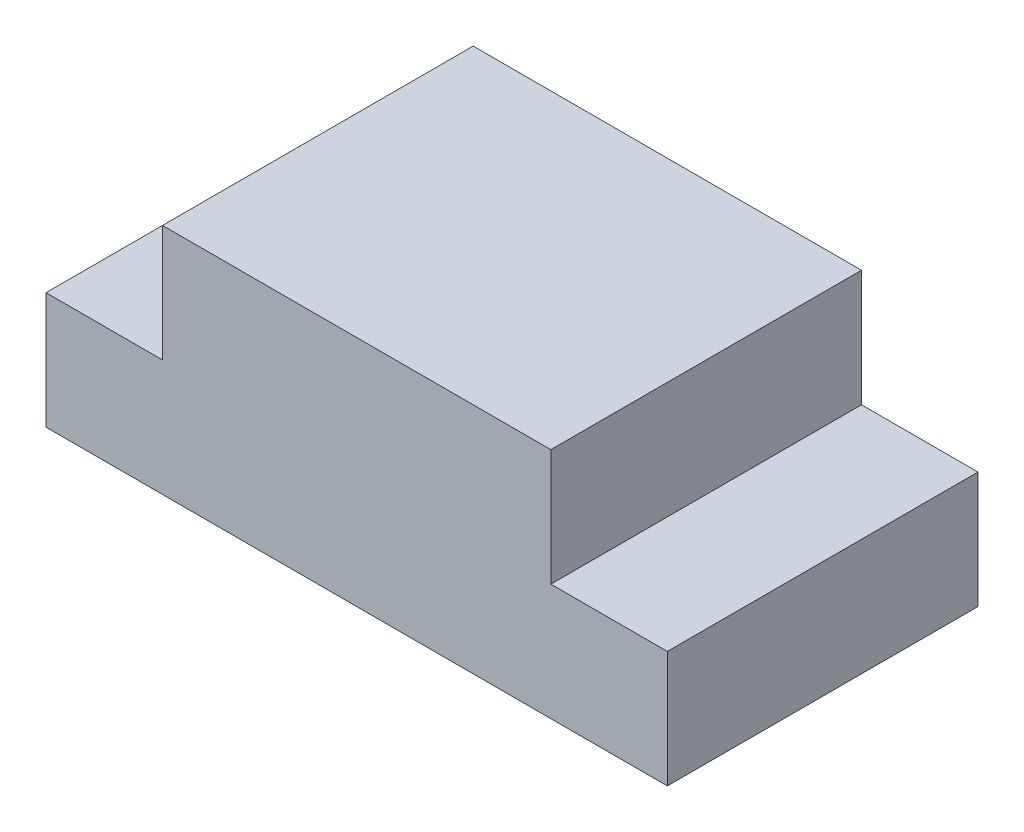
ISO-10303-21;
HEADER;
FILE_DESCRIPTION(('STEP AP214'),'2;1');
FILE_NAME('part.step','',(''),(''),'','','');
FILE_SCHEMA(('AUTOMOTIVE_DESIGN { 1 0 10303 214 1 1 1 1 }'));
ENDSEC;
DATA;
#1=APPLICATION_CONTEXT('core data for automotive mechanical design processes');
#2=APPLICATION_PROTOCOL_DEFINITION('international standard','automotive_design',2000,#1);
#3=PRODUCT_CONTEXT('',#1,'mechanical');
#4=PRODUCT('Part','Part','',(#3));
#5=PRODUCT_RELATED_PRODUCT_CATEGORY('part','',(#4));
#6=PRODUCT_DEFINITION_FORMATION('','',#4);
#7=PRODUCT_DEFINITION_CONTEXT('part definition',#1,'design');
#8=PRODUCT_DEFINITION('design','',#6,#7);
#9=PRODUCT_DEFINITION_SHAPE('','',#8);
#10=(LENGTH_UNIT() NAMED_UNIT(*) SI_UNIT(.MILLI.,.METRE.));
#11=(NAMED_UNIT(*) PLANE_ANGLE_UNIT() SI_UNIT($,.RADIAN.));
#12=(NAMED_UNIT(*) SI_UNIT($,.STERADIAN.) SOLID_ANGLE_UNIT());
#13=UNCERTAINTY_MEASURE_WITH_UNIT(LENGTH_MEASURE(1.E-05),#10,'distance_accuracy_value','');
#14=(GEOMETRIC_REPRESENTATION_CONTEXT(3) GLOBAL_UNCERTAINTY_ASSIGNED_CONTEXT((#13)) GLOBAL_UNIT_ASSIGNED_CONTEXT((#10,
#11,#12)) REPRESENTATION_CONTEXT('',''));
#15=CARTESIAN_POINT('',(0.,0.,0.));
#16=DIRECTION('',(0.,0.,1.));
#17=DIRECTION('',(1.,0.,0.));
#18=AXIS2_PLACEMENT_3D('',#15,#16,#17);
#19=CARTESIAN_POINT('',(0.,0.3,0.));
#20=DIRECTION('',(0.,-1.,0.));
#21=DIRECTION('',(0.,0.,-1.));
#22=AXIS2_PLACEMENT_3D('',#19,#20,#21);
#23=PLANE('',#22);
#24=DIRECTION('',(-1.,0.,0.));
#25=VECTOR('',#24,1.);
#26=CARTESIAN_POINT('',(-0.8,0.3,0.4));
#27=LINE('',#26,#25);
#28=CARTESIAN_POINT('',(0.5,0.3,0.4));
#29=VERTEX_POINT('',#28);
#30=CARTESIAN_POINT('',(0.8,0.3,0.4));
#31=VERTEX_POINT('',#30);
#32=EDGE_CURVE('E121',#29,#31,#27,.F.);
#33=ORIENTED_EDGE('',*,*,#32,.T.);
#34=DIRECTION('',(0.,0.,1.));
#35=VECTOR('',#34,1.);
#36=CARTESIAN_POINT('',(0.8,0.3,0.4));
#37=LINE('',#36,#35);
#38=CARTESIAN_POINT('',(0.8,0.3,-0.4));
#39=VERTEX_POINT('',#38);
#40=EDGE_CURVE('E95',#31,#39,#37,.F.);
#41=ORIENTED_EDGE('',*,*,#40,.T.);
#42=DIRECTION('',(1.,0.,0.));
#43=VECTOR('',#42,1.);
#44=CARTESIAN_POINT('',(-0.8,0.3,-0.4));
#45=LINE('',#44,#43);
#46=CARTESIAN_POINT('',(0.5,0.3,-0.4));
#47=VERTEX_POINT('',#46);
#48=EDGE_CURVE('E124',#39,#47,#45,.F.);
#49=ORIENTED_EDGE('',*,*,#48,.T.);
#50=DIRECTION('',(0.,0.,1.));
#51=VECTOR('',#50,1.);
#52=CARTESIAN_POINT('',(0.5,0.3,0.4));
#53=LINE('',#52,#51);
#54=EDGE_CURVE('E20',#47,#29,#53,.T.);
#55=ORIENTED_EDGE('',*,*,#54,.T.);
#56=EDGE_LOOP('',(#33,#41,#49,#55));
#57=FACE_BOUND('',#56,.T.);
#58=ADVANCED_FACE('F17',(#57),#23,.F.);
#59=CARTESIAN_POINT('',(0.5,0.6,0.4));
#60=DIRECTION('',(-1.,0.,0.));
#61=DIRECTION('',(0.,0.,1.));
#62=AXIS2_PLACEMENT_3D('',#59,#60,#61);
#63=PLANE('',#62);
#64=DIRECTION('',(0.,1.,0.));
#65=VECTOR('',#64,1.);
#66=CARTESIAN_POINT('',(0.5,0.3,-0.4));
#67=LINE('',#66,#65);
#68=CARTESIAN_POINT('',(0.5,0.6,-0.4));
#69=VERTEX_POINT('',#68);
#70=EDGE_CURVE('E139',#47,#69,#67,.T.);
#71=ORIENTED_EDGE('',*,*,#70,.T.);
#72=DIRECTION('',(0.,0.,-1.));
#73=VECTOR('',#72,1.);
#74=CARTESIAN_POINT('',(0.5,0.6,0.));
#75=LINE('',#74,#73);
#76=CARTESIAN_POINT('',(0.5,0.6,0.4));
#77=VERTEX_POINT('',#76);
#78=EDGE_CURVE('E114',#69,#77,#75,.F.);
#79=ORIENTED_EDGE('',*,*,#78,.T.);
#80=DIRECTION('',(0.,1.,0.));
#81=VECTOR('',#80,1.);
#82=CARTESIAN_POINT('',(0.5,0.3,0.4));
#83=LINE('',#82,#81);
#84=EDGE_CURVE('E109',#77,#29,#83,.F.);
#85=ORIENTED_EDGE('',*,*,#84,.T.);
#86=ORIENTED_EDGE('',*,*,#54,.F.);
#87=EDGE_LOOP('',(#71,#79,#85,#86));
#88=FACE_BOUND('',#87,.T.);
#89=ADVANCED_FACE('F126',(#88),#63,.F.);
#90=CARTESIAN_POINT('',(0.,0.6,0.));
#91=DIRECTION('',(0.,-1.,0.));
#92=DIRECTION('',(0.,0.,-1.));
#93=AXIS2_PLACEMENT_3D('',#90,#91,#92);
#94=PLANE('',#93);
#95=DIRECTION('',(1.,0.,0.));
#96=VECTOR('',#95,1.);
#97=CARTESIAN_POINT('',(-0.8,0.6,-0.4));
#98=LINE('',#97,#96);
#99=CARTESIAN_POINT('',(-0.5,0.6,-0.4));
#100=VERTEX_POINT('',#99);
#101=EDGE_CURVE('E141',#69,#100,#98,.F.);
#102=ORIENTED_EDGE('',*,*,#101,.T.);
#103=DIRECTION('',(0.,0.,-1.));
#104=VECTOR('',#103,1.);
#105=CARTESIAN_POINT('',(-0.5,0.6,0.4));
#106=LINE('',#105,#104);
#107=CARTESIAN_POINT('',(-0.5,0.6,0.4));
#108=VERTEX_POINT('',#107);
#109=EDGE_CURVE('E80',#100,#108,#106,.F.);
#110=ORIENTED_EDGE('',*,*,#109,.T.);
#111=DIRECTION('',(-1.,0.,0.));
#112=VECTOR('',#111,1.);
#113=CARTESIAN_POINT('',(-0.8,0.6,0.4));
#114=LINE('',#113,#112);
#115=EDGE_CURVE('E107',#108,#77,#114,.F.);
#116=ORIENTED_EDGE('',*,*,#115,.T.);
#117=ORIENTED_EDGE('',*,*,#78,.F.);
#118=EDGE_LOOP('',(#102,#110,#116,#117));
#119=FACE_BOUND('',#118,.T.);
#120=ADVANCED_FACE('F163',(#119),#94,.F.);
#121=CARTESIAN_POINT('',(-0.5,0.6,0.4));
#122=DIRECTION('',(1.,0.,0.));
#123=DIRECTION('',(0.,0.,-1.));
#124=AXIS2_PLACEMENT_3D('',#121,#122,#123);
#125=PLANE('',#124);
#126=DIRECTION('',(0.,1.,0.));
#127=VECTOR('',#126,1.);
#128=CARTESIAN_POINT('',(-0.5,0.3,0.4));
#129=LINE('',#128,#127);
#130=CARTESIAN_POINT('',(-0.5,0.3,0.4));
#131=VERTEX_POINT('',#130);
#132=EDGE_CURVE('E89',#131,#108,#129,.T.);
#133=ORIENTED_EDGE('',*,*,#132,.T.);
#134=ORIENTED_EDGE('',*,*,#109,.F.);
#135=DIRECTION('',(0.,1.,0.));
#136=VECTOR('',#135,1.);
#137=CARTESIAN_POINT('',(-0.5,0.3,-0.4));
#138=LINE('',#137,#136);
#139=CARTESIAN_POINT('',(-0.5,0.3,-0.4));
#140=VERTEX_POINT('',#139);
#141=EDGE_CURVE('E92',#100,#140,#138,.F.);
#142=ORIENTED_EDGE('',*,*,#141,.T.);
#143=DIRECTION('',(0.,0.,-1.));
#144=VECTOR('',#143,1.);
#145=CARTESIAN_POINT('',(-0.5,0.3,0.));
#146=LINE('',#145,#144);
#147=EDGE_CURVE('E85',#140,#131,#146,.F.);
#148=ORIENTED_EDGE('',*,*,#147,.T.);
#149=EDGE_LOOP('',(#133,#134,#142,#148));
#150=FACE_BOUND('',#149,.T.);
#151=ADVANCED_FACE('F87',(#150),#125,.F.);
#152=CARTESIAN_POINT('',(0.,0.3,0.));
#153=DIRECTION('',(0.,-1.,0.));
#154=DIRECTION('',(0.,0.,-1.));
#155=AXIS2_PLACEMENT_3D('',#152,#153,#154);
#156=PLANE('',#155);
#157=DIRECTION('',(1.,0.,0.));
#158=VECTOR('',#157,1.);
#159=CARTESIAN_POINT('',(-0.8,0.3,-0.4));
#160=LINE('',#159,#158);
#161=CARTESIAN_POINT('',(-0.8,0.3,-0.4));
#162=VERTEX_POINT('',#161);
#163=EDGE_CURVE('E144',#140,#162,#160,.F.);
#164=ORIENTED_EDGE('',*,*,#163,.T.);
#165=DIRECTION('',(0.,0.,-1.));
#166=VECTOR('',#165,1.);
#167=CARTESIAN_POINT('',(-0.8,0.3,0.4));
#168=LINE('',#167,#166);
#169=CARTESIAN_POINT('',(-0.8,0.3,0.4));
#170=VERTEX_POINT('',#169);
#171=EDGE_CURVE('E100',#162,#170,#168,.F.);
#172=ORIENTED_EDGE('',*,*,#171,.T.);
#173=DIRECTION('',(-1.,0.,0.));
#174=VECTOR('',#173,1.);
#175=CARTESIAN_POINT('',(-0.8,0.3,0.4));
#176=LINE('',#175,#174);
#177=EDGE_CURVE('E98',#170,#131,#176,.F.);
#178=ORIENTED_EDGE('',*,*,#177,.T.);
#179=ORIENTED_EDGE('',*,*,#147,.F.);
#180=EDGE_LOOP('',(#164,#172,#178,#179));
#181=FACE_BOUND('',#180,.T.);
#182=ADVANCED_FACE('F99',(#181),#156,.F.);
#183=CARTESIAN_POINT('',(0.8,0.3,0.4));
#184=DIRECTION('',(-1.,0.,0.));
#185=DIRECTION('',(0.,0.,1.));
#186=AXIS2_PLACEMENT_3D('',#183,#184,#185);
#187=PLANE('',#186);
#188=DIRECTION('',(0.,1.,0.));
#189=VECTOR('',#188,1.);
#190=CARTESIAN_POINT('',(0.8,0.3,-0.4));
#191=LINE('',#190,#189);
#192=CARTESIAN_POINT('',(0.8,0.,-0.4));
#193=VERTEX_POINT('',#192);
#194=EDGE_CURVE('E135',#193,#39,#191,.T.);
#195=ORIENTED_EDGE('',*,*,#194,.T.);
#196=ORIENTED_EDGE('',*,*,#40,.F.);
#197=DIRECTION('',(0.,1.,0.));
#198=VECTOR('',#197,1.);
#199=CARTESIAN_POINT('',(0.8,0.3,0.4));
#200=LINE('',#199,#198);
#201=CARTESIAN_POINT('',(0.8,0.,0.4));
#202=VERTEX_POINT('',#201);
#203=EDGE_CURVE('E128',#31,#202,#200,.F.);
#204=ORIENTED_EDGE('',*,*,#203,.T.);
#205=DIRECTION('',(0.,0.,-1.));
#206=VECTOR('',#205,1.);
#207=CARTESIAN_POINT('',(0.8,0.,0.));
#208=LINE('',#207,#206);
#209=EDGE_CURVE('E147',#193,#202,#208,.F.);
#210=ORIENTED_EDGE('',*,*,#209,.F.);
#211=EDGE_LOOP('',(#195,#196,#204,#210));
#212=FACE_BOUND('',#211,.T.);
#213=ADVANCED_FACE('F159',(#212),#187,.F.);
#214=CARTESIAN_POINT('',(-0.8,0.3,0.4));
#215=DIRECTION('',(0.,0.,-1.));
#216=DIRECTION('',(-1.,0.,0.));
#217=AXIS2_PLACEMENT_3D('',#214,#215,#216);
#218=PLANE('',#217);
#219=ORIENTED_EDGE('',*,*,#203,.F.);
#220=ORIENTED_EDGE('',*,*,#32,.F.);
#221=ORIENTED_EDGE('',*,*,#84,.F.);
#222=ORIENTED_EDGE('',*,*,#115,.F.);
#223=ORIENTED_EDGE('',*,*,#132,.F.);
#224=ORIENTED_EDGE('',*,*,#177,.F.);
#225=DIRECTION('',(0.,1.,0.));
#226=VECTOR('',#225,1.);
#227=CARTESIAN_POINT('',(-0.8,0.3,0.4));
#228=LINE('',#227,#226);
#229=CARTESIAN_POINT('',(-0.8,0.,0.4));
#230=VERTEX_POINT('',#229);
#231=EDGE_CURVE('E133',#170,#230,#228,.F.);
#232=ORIENTED_EDGE('',*,*,#231,.T.);
#233=DIRECTION('',(1.,0.,0.));
#234=VECTOR('',#233,1.);
#235=CARTESIAN_POINT('',(0.,0.,0.4));
#236=LINE('',#235,#234);
#237=EDGE_CURVE('E150',#202,#230,#236,.F.);
#238=ORIENTED_EDGE('',*,*,#237,.F.);
#239=EDGE_LOOP('',(#219,#220,#221,#222,#223,#224,#232,#238));
#240=FACE_BOUND('',#239,.T.);
#241=ADVANCED_FACE('F105',(#240),#218,.F.);
#242=CARTESIAN_POINT('',(-0.8,0.3,0.4));
#243=DIRECTION('',(1.,0.,0.));
#244=DIRECTION('',(0.,0.,-1.));
#245=AXIS2_PLACEMENT_3D('',#242,#243,#244);
#246=PLANE('',#245);
#247=ORIENTED_EDGE('',*,*,#231,.F.);
#248=ORIENTED_EDGE('',*,*,#171,.F.);
#249=DIRECTION('',(0.,1.,0.));
#250=VECTOR('',#249,1.);
#251=CARTESIAN_POINT('',(-0.8,0.3,-0.4));
#252=LINE('',#251,#250);
#253=CARTESIAN_POINT('',(-0.8,0.,-0.4));
#254=VERTEX_POINT('',#253);
#255=EDGE_CURVE('E35',#162,#254,#252,.F.);
#256=ORIENTED_EDGE('',*,*,#255,.T.);
#257=DIRECTION('',(0.,0.,-1.));
#258=VECTOR('',#257,1.);
#259=CARTESIAN_POINT('',(-0.8,0.,0.));
#260=LINE('',#259,#258);
#261=EDGE_CURVE('E26',#230,#254,#260,.T.);
#262=ORIENTED_EDGE('',*,*,#261,.F.);
#263=EDGE_LOOP('',(#247,#248,#256,#262));
#264=FACE_BOUND('',#263,.T.);
#265=ADVANCED_FACE('F156',(#264),#246,.F.);
#266=CARTESIAN_POINT('',(-0.8,0.3,-0.4));
#267=DIRECTION('',(0.,0.,1.));
#268=DIRECTION('',(1.,0.,0.));
#269=AXIS2_PLACEMENT_3D('',#266,#267,#268);
#270=PLANE('',#269);
#271=ORIENTED_EDGE('',*,*,#255,.F.);
#272=ORIENTED_EDGE('',*,*,#163,.F.);
#273=ORIENTED_EDGE('',*,*,#141,.F.);
#274=ORIENTED_EDGE('',*,*,#101,.F.);
#275=ORIENTED_EDGE('',*,*,#70,.F.);
#276=ORIENTED_EDGE('',*,*,#48,.F.);
#277=ORIENTED_EDGE('',*,*,#194,.F.);
#278=DIRECTION('',(1.,0.,0.));
#279=VECTOR('',#278,1.);
#280=CARTESIAN_POINT('',(0.,0.,-0.4));
#281=LINE('',#280,#279);
#282=EDGE_CURVE('E11',#254,#193,#281,.T.);
#283=ORIENTED_EDGE('',*,*,#282,.F.);
#284=EDGE_LOOP('',(#271,#272,#273,#274,#275,#276,#277,#283));
#285=FACE_BOUND('',#284,.T.);
#286=ADVANCED_FACE('F161',(#285),#270,.F.);
#287=CARTESIAN_POINT('',(0.,0.,0.));
#288=DIRECTION('',(0.,-1.,0.));
#289=DIRECTION('',(0.,0.,-1.));
#290=AXIS2_PLACEMENT_3D('',#287,#288,#289);
#291=PLANE('',#290);
#292=ORIENTED_EDGE('',*,*,#261,.T.);
#293=ORIENTED_EDGE('',*,*,#282,.T.);
#294=ORIENTED_EDGE('',*,*,#209,.T.);
#295=ORIENTED_EDGE('',*,*,#237,.T.);
#296=EDGE_LOOP('',(#292,#293,#294,#295));
#297=FACE_BOUND('',#296,.T.);
#298=ADVANCED_FACE('F155',(#297),#291,.T.);
#299=CLOSED_SHELL('',(#58,#89,#120,#151,#182,#213,#241,#265,#286,#298));
#300=MANIFOLD_SOLID_BREP('B1',#299);
#301=ADVANCED_BREP_SHAPE_REPRESENTATION('',(#18,#300),#14);
#302=SHAPE_DEFINITION_REPRESENTATION(#9,#301);
ENDSEC;
END-ISO-10303-21;
